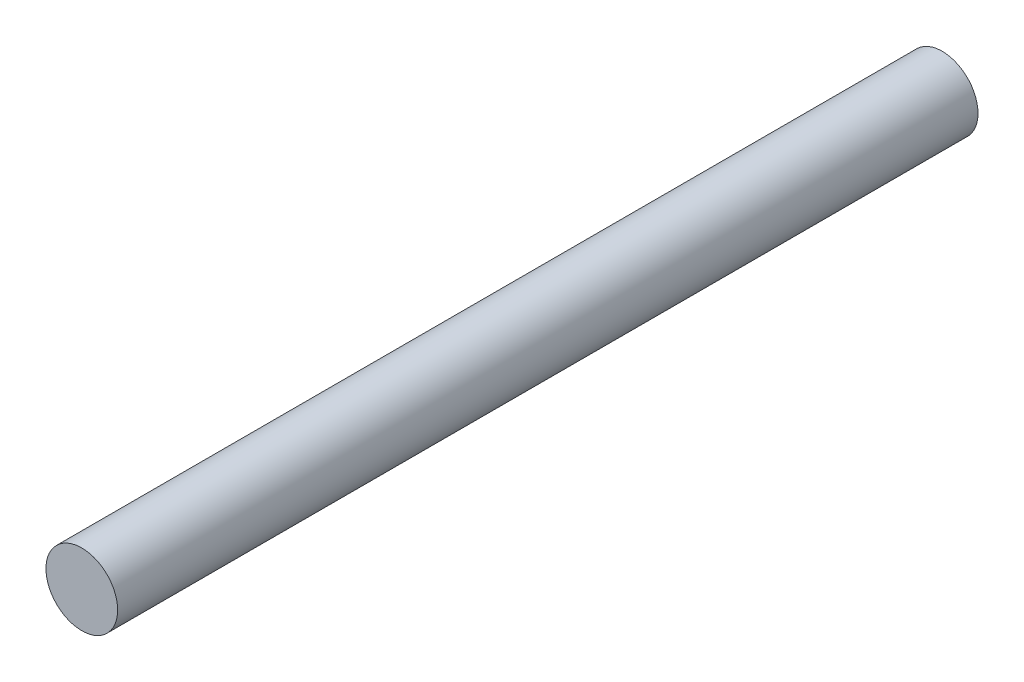
ISO-10303-21;
HEADER;
FILE_DESCRIPTION(('STEP AP214'),'2;1');
FILE_NAME('part.step','',(''),(''),'','','');
FILE_SCHEMA(('AUTOMOTIVE_DESIGN { 1 0 10303 214 1 1 1 1 }'));
ENDSEC;
DATA;
#1=APPLICATION_CONTEXT('core data for automotive mechanical design processes');
#2=APPLICATION_PROTOCOL_DEFINITION('international standard','automotive_design',2000,#1);
#3=PRODUCT_CONTEXT('',#1,'mechanical');
#4=PRODUCT('Part','Part','',(#3));
#5=PRODUCT_RELATED_PRODUCT_CATEGORY('part','',(#4));
#6=PRODUCT_DEFINITION_FORMATION('','',#4);
#7=PRODUCT_DEFINITION_CONTEXT('part definition',#1,'design');
#8=PRODUCT_DEFINITION('design','',#6,#7);
#9=PRODUCT_DEFINITION_SHAPE('','',#8);
#10=(LENGTH_UNIT() NAMED_UNIT(*) SI_UNIT(.MILLI.,.METRE.));
#11=(NAMED_UNIT(*) PLANE_ANGLE_UNIT() SI_UNIT($,.RADIAN.));
#12=(NAMED_UNIT(*) SI_UNIT($,.STERADIAN.) SOLID_ANGLE_UNIT());
#13=UNCERTAINTY_MEASURE_WITH_UNIT(LENGTH_MEASURE(1.E-05),#10,'distance_accuracy_value','');
#14=(GEOMETRIC_REPRESENTATION_CONTEXT(3) GLOBAL_UNCERTAINTY_ASSIGNED_CONTEXT((#13)) GLOBAL_UNIT_ASSIGNED_CONTEXT((#10,
#11,#12)) REPRESENTATION_CONTEXT('',''));
#15=CARTESIAN_POINT('',(0.,0.,0.));
#16=DIRECTION('',(0.,0.,1.));
#17=DIRECTION('',(1.,0.,0.));
#18=AXIS2_PLACEMENT_3D('',#15,#16,#17);
#19=CARTESIAN_POINT('',(0.,0.,60.));
#20=DIRECTION('',(0.,0.,-1.));
#21=DIRECTION('',(-1.,0.,0.));
#22=AXIS2_PLACEMENT_3D('',#19,#20,#21);
#23=CYLINDRICAL_SURFACE('',#22,5.);
#24=CARTESIAN_POINT('',(0.,0.,60.));
#25=DIRECTION('',(0.,0.,1.));
#26=DIRECTION('',(1.,0.,0.));
#27=AXIS2_PLACEMENT_3D('',#24,#25,#26);
#28=CIRCLE('',#27,5.);
#29=CARTESIAN_POINT('',(5.,0.,60.));
#30=VERTEX_POINT('',#29);
#31=EDGE_CURVE('E10',#30,#30,#28,.T.);
#32=ORIENTED_EDGE('',*,*,#31,.F.);
#33=EDGE_LOOP('',(#32));
#34=FACE_BOUND('',#33,.T.);
#35=CARTESIAN_POINT('',(0.,0.,-60.));
#36=DIRECTION('',(0.,0.,1.));
#37=DIRECTION('',(1.,0.,0.));
#38=AXIS2_PLACEMENT_3D('',#35,#36,#37);
#39=CIRCLE('',#38,5.);
#40=CARTESIAN_POINT('',(5.,0.,-60.));
#41=VERTEX_POINT('',#40);
#42=EDGE_CURVE('E40',#41,#41,#39,.T.);
#43=ORIENTED_EDGE('',*,*,#42,.T.);
#44=EDGE_LOOP('',(#43));
#45=FACE_BOUND('',#44,.T.);
#46=ADVANCED_FACE('F37',(#34,#45),#23,.T.);
#47=CARTESIAN_POINT('',(0.,0.,60.));
#48=DIRECTION('',(0.,0.,1.));
#49=DIRECTION('',(1.,0.,0.));
#50=AXIS2_PLACEMENT_3D('',#47,#48,#49);
#51=PLANE('',#50);
#52=ORIENTED_EDGE('',*,*,#31,.T.);
#53=EDGE_LOOP('',(#52));
#54=FACE_BOUND('',#53,.T.);
#55=ADVANCED_FACE('F54',(#54),#51,.T.);
#56=CARTESIAN_POINT('',(0.,0.,-60.));
#57=DIRECTION('',(0.,0.,1.));
#58=DIRECTION('',(1.,0.,0.));
#59=AXIS2_PLACEMENT_3D('',#56,#57,#58);
#60=PLANE('',#59);
#61=ORIENTED_EDGE('',*,*,#42,.F.);
#62=EDGE_LOOP('',(#61));
#63=FACE_BOUND('',#62,.T.);
#64=ADVANCED_FACE('F52',(#63),#60,.F.);
#65=CLOSED_SHELL('',(#46,#55,#64));
#66=MANIFOLD_SOLID_BREP('B2',#65);
#67=ADVANCED_BREP_SHAPE_REPRESENTATION('',(#18,#66),#14);
#68=SHAPE_DEFINITION_REPRESENTATION(#9,#67);
ENDSEC;
END-ISO-10303-21;
